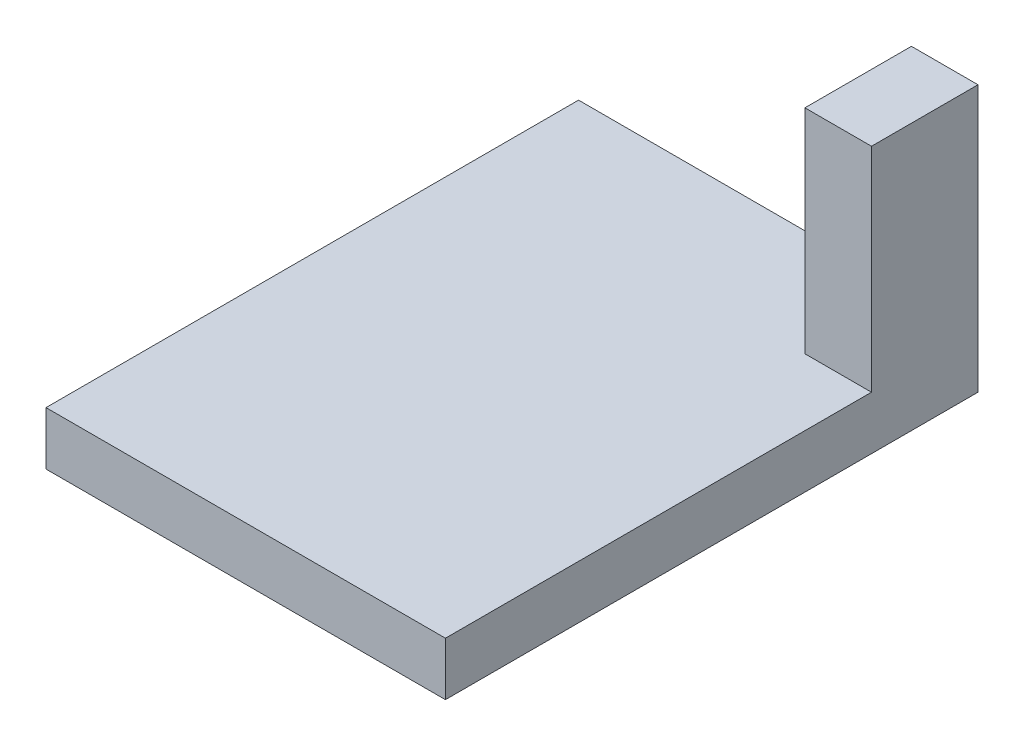
ISO-10303-21;
HEADER;
FILE_DESCRIPTION(('STEP AP214'),'2;1');
FILE_NAME('part.step','',(''),(''),'','','');
FILE_SCHEMA(('AUTOMOTIVE_DESIGN { 1 0 10303 214 1 1 1 1 }'));
ENDSEC;
DATA;
#1=APPLICATION_CONTEXT('core data for automotive mechanical design processes');
#2=APPLICATION_PROTOCOL_DEFINITION('international standard','automotive_design',2000,#1);
#3=PRODUCT_CONTEXT('',#1,'mechanical');
#4=PRODUCT('Part','Part','',(#3));
#5=PRODUCT_RELATED_PRODUCT_CATEGORY('part','',(#4));
#6=PRODUCT_DEFINITION_FORMATION('','',#4);
#7=PRODUCT_DEFINITION_CONTEXT('part definition',#1,'design');
#8=PRODUCT_DEFINITION('design','',#6,#7);
#9=PRODUCT_DEFINITION_SHAPE('','',#8);
#10=(LENGTH_UNIT() NAMED_UNIT(*) SI_UNIT(.MILLI.,.METRE.));
#11=(NAMED_UNIT(*) PLANE_ANGLE_UNIT() SI_UNIT($,.RADIAN.));
#12=(NAMED_UNIT(*) SI_UNIT($,.STERADIAN.) SOLID_ANGLE_UNIT());
#13=UNCERTAINTY_MEASURE_WITH_UNIT(LENGTH_MEASURE(1.E-05),#10,'distance_accuracy_value','');
#14=(GEOMETRIC_REPRESENTATION_CONTEXT(3) GLOBAL_UNCERTAINTY_ASSIGNED_CONTEXT((#13)) GLOBAL_UNIT_ASSIGNED_CONTEXT((#10,
#11,#12)) REPRESENTATION_CONTEXT('',''));
#15=CARTESIAN_POINT('',(0.,0.,0.));
#16=DIRECTION('',(0.,0.,1.));
#17=DIRECTION('',(1.,0.,0.));
#18=AXIS2_PLACEMENT_3D('',#15,#16,#17);
#19=CARTESIAN_POINT('',(0.,8.,0.));
#20=DIRECTION('',(1.,0.,0.));
#21=DIRECTION('',(0.,0.,-1.));
#22=AXIS2_PLACEMENT_3D('',#19,#20,#21);
#23=PLANE('',#22);
#24=DIRECTION('',(0.,0.,1.));
#25=VECTOR('',#24,1.);
#26=CARTESIAN_POINT('',(0.,0.,0.));
#27=LINE('',#26,#25);
#28=CARTESIAN_POINT('',(0.,0.,-4.));
#29=VERTEX_POINT('',#28);
#30=CARTESIAN_POINT('',(0.,0.,0.));
#31=VERTEX_POINT('',#30);
#32=EDGE_CURVE('E117',#29,#31,#27,.T.);
#33=ORIENTED_EDGE('',*,*,#32,.T.);
#34=DIRECTION('',(0.,-1.,0.));
#35=VECTOR('',#34,1.);
#36=CARTESIAN_POINT('',(0.,8.,0.));
#37=LINE('',#36,#35);
#38=CARTESIAN_POINT('',(0.,8.,0.));
#39=VERTEX_POINT('',#38);
#40=EDGE_CURVE('E11',#39,#31,#37,.T.);
#41=ORIENTED_EDGE('',*,*,#40,.F.);
#42=DIRECTION('',(0.,0.,1.));
#43=VECTOR('',#42,1.);
#44=CARTESIAN_POINT('',(0.,8.,0.));
#45=LINE('',#44,#43);
#46=CARTESIAN_POINT('',(0.,8.,-4.));
#47=VERTEX_POINT('',#46);
#48=EDGE_CURVE('E126',#47,#39,#45,.T.);
#49=ORIENTED_EDGE('',*,*,#48,.F.);
#50=DIRECTION('',(0.,-1.,0.));
#51=VECTOR('',#50,1.);
#52=CARTESIAN_POINT('',(0.,8.,-4.));
#53=LINE('',#52,#51);
#54=EDGE_CURVE('E132',#47,#29,#53,.T.);
#55=ORIENTED_EDGE('',*,*,#54,.T.);
#56=EDGE_LOOP('',(#33,#41,#49,#55));
#57=FACE_BOUND('',#56,.T.);
#58=ADVANCED_FACE('F37',(#57),#23,.F.);
#59=CARTESIAN_POINT('',(0.,8.,0.));
#60=DIRECTION('',(0.,0.,-1.));
#61=DIRECTION('',(-1.,0.,0.));
#62=AXIS2_PLACEMENT_3D('',#59,#60,#61);
#63=PLANE('',#62);
#64=DIRECTION('',(1.,0.,0.));
#65=VECTOR('',#64,1.);
#66=CARTESIAN_POINT('',(0.,0.,0.));
#67=LINE('',#66,#65);
#68=CARTESIAN_POINT('',(2.5,0.,0.));
#69=VERTEX_POINT('',#68);
#70=EDGE_CURVE('E120',#31,#69,#67,.T.);
#71=ORIENTED_EDGE('',*,*,#70,.T.);
#72=DIRECTION('',(0.,-1.,0.));
#73=VECTOR('',#72,1.);
#74=CARTESIAN_POINT('',(2.5,8.,0.));
#75=LINE('',#74,#73);
#76=CARTESIAN_POINT('',(2.5,8.,0.));
#77=VERTEX_POINT('',#76);
#78=EDGE_CURVE('E45',#77,#69,#75,.T.);
#79=ORIENTED_EDGE('',*,*,#78,.F.);
#80=DIRECTION('',(1.,0.,0.));
#81=VECTOR('',#80,1.);
#82=CARTESIAN_POINT('',(0.,8.,0.));
#83=LINE('',#82,#81);
#84=EDGE_CURVE('E128',#39,#77,#83,.T.);
#85=ORIENTED_EDGE('',*,*,#84,.F.);
#86=ORIENTED_EDGE('',*,*,#40,.T.);
#87=EDGE_LOOP('',(#71,#79,#85,#86));
#88=FACE_BOUND('',#87,.T.);
#89=ADVANCED_FACE('F142',(#88),#63,.F.);
#90=CARTESIAN_POINT('',(2.5,8.,0.));
#91=DIRECTION('',(-1.,0.,0.));
#92=DIRECTION('',(0.,0.,1.));
#93=AXIS2_PLACEMENT_3D('',#90,#91,#92);
#94=PLANE('',#93);
#95=ORIENTED_EDGE('',*,*,#78,.T.);
#96=DIRECTION('',(0.,0.,1.));
#97=VECTOR('',#96,1.);
#98=CARTESIAN_POINT('',(2.5,0.,-4.));
#99=LINE('',#98,#97);
#100=CARTESIAN_POINT('',(2.5,0.,16.));
#101=VERTEX_POINT('',#100);
#102=EDGE_CURVE('E115',#69,#101,#99,.T.);
#103=ORIENTED_EDGE('',*,*,#102,.T.);
#104=DIRECTION('',(0.,1.,0.));
#105=VECTOR('',#104,1.);
#106=CARTESIAN_POINT('',(2.5,-2.,16.));
#107=LINE('',#106,#105);
#108=CARTESIAN_POINT('',(2.5,-2.,16.));
#109=VERTEX_POINT('',#108);
#110=EDGE_CURVE('E95',#109,#101,#107,.T.);
#111=ORIENTED_EDGE('',*,*,#110,.F.);
#112=DIRECTION('',(0.,0.,1.));
#113=VECTOR('',#112,1.);
#114=CARTESIAN_POINT('',(2.5,-2.,-4.));
#115=LINE('',#114,#113);
#116=CARTESIAN_POINT('',(2.5,-2.,-4.));
#117=VERTEX_POINT('',#116);
#118=EDGE_CURVE('E101',#117,#109,#115,.T.);
#119=ORIENTED_EDGE('',*,*,#118,.F.);
#120=DIRECTION('',(0.,-1.,0.));
#121=VECTOR('',#120,1.);
#122=CARTESIAN_POINT('',(2.5,8.,-4.));
#123=LINE('',#122,#121);
#124=CARTESIAN_POINT('',(2.5,8.,-4.));
#125=VERTEX_POINT('',#124);
#126=EDGE_CURVE('E138',#125,#117,#123,.T.);
#127=ORIENTED_EDGE('',*,*,#126,.F.);
#128=DIRECTION('',(0.,0.,-1.));
#129=VECTOR('',#128,1.);
#130=CARTESIAN_POINT('',(2.5,8.,0.));
#131=LINE('',#130,#129);
#132=EDGE_CURVE('E130',#77,#125,#131,.T.);
#133=ORIENTED_EDGE('',*,*,#132,.F.);
#134=EDGE_LOOP('',(#95,#103,#111,#119,#127,#133));
#135=FACE_BOUND('',#134,.T.);
#136=ADVANCED_FACE('F113',(#135),#94,.F.);
#137=CARTESIAN_POINT('',(0.,8.,-4.));
#138=DIRECTION('',(0.,0.,1.));
#139=DIRECTION('',(1.,0.,0.));
#140=AXIS2_PLACEMENT_3D('',#137,#138,#139);
#141=PLANE('',#140);
#142=ORIENTED_EDGE('',*,*,#126,.T.);
#143=DIRECTION('',(1.,0.,0.));
#144=VECTOR('',#143,1.);
#145=CARTESIAN_POINT('',(2.5,-2.,-4.));
#146=LINE('',#145,#144);
#147=CARTESIAN_POINT('',(-12.5,-2.,-4.));
#148=VERTEX_POINT('',#147);
#149=EDGE_CURVE('E107',#148,#117,#146,.T.);
#150=ORIENTED_EDGE('',*,*,#149,.F.);
#151=DIRECTION('',(0.,1.,0.));
#152=VECTOR('',#151,1.);
#153=CARTESIAN_POINT('',(-12.5,-2.,-4.));
#154=LINE('',#153,#152);
#155=CARTESIAN_POINT('',(-12.5,0.,-4.));
#156=VERTEX_POINT('',#155);
#157=EDGE_CURVE('E122',#148,#156,#154,.T.);
#158=ORIENTED_EDGE('',*,*,#157,.T.);
#159=DIRECTION('',(1.,0.,0.));
#160=VECTOR('',#159,1.);
#161=CARTESIAN_POINT('',(2.5,0.,-4.));
#162=LINE('',#161,#160);
#163=EDGE_CURVE('E110',#156,#29,#162,.T.);
#164=ORIENTED_EDGE('',*,*,#163,.T.);
#165=ORIENTED_EDGE('',*,*,#54,.F.);
#166=DIRECTION('',(-1.,0.,0.));
#167=VECTOR('',#166,1.);
#168=CARTESIAN_POINT('',(0.,8.,-4.));
#169=LINE('',#168,#167);
#170=EDGE_CURVE('E52',#125,#47,#169,.T.);
#171=ORIENTED_EDGE('',*,*,#170,.F.);
#172=EDGE_LOOP('',(#142,#150,#158,#164,#165,#171));
#173=FACE_BOUND('',#172,.T.);
#174=ADVANCED_FACE('F162',(#173),#141,.F.);
#175=CARTESIAN_POINT('',(0.,8.,0.));
#176=DIRECTION('',(0.,-1.,0.));
#177=DIRECTION('',(0.,0.,-1.));
#178=AXIS2_PLACEMENT_3D('',#175,#176,#177);
#179=PLANE('',#178);
#180=ORIENTED_EDGE('',*,*,#48,.T.);
#181=ORIENTED_EDGE('',*,*,#84,.T.);
#182=ORIENTED_EDGE('',*,*,#132,.T.);
#183=ORIENTED_EDGE('',*,*,#170,.T.);
#184=EDGE_LOOP('',(#180,#181,#182,#183));
#185=FACE_BOUND('',#184,.T.);
#186=ADVANCED_FACE('F165',(#185),#179,.F.);
#187=CARTESIAN_POINT('',(2.5,-2.,16.));
#188=DIRECTION('',(0.,0.,-1.));
#189=DIRECTION('',(-1.,0.,0.));
#190=AXIS2_PLACEMENT_3D('',#187,#188,#189);
#191=PLANE('',#190);
#192=DIRECTION('',(-1.,0.,0.));
#193=VECTOR('',#192,1.);
#194=CARTESIAN_POINT('',(2.5,0.,16.));
#195=LINE('',#194,#193);
#196=CARTESIAN_POINT('',(-12.5,0.,16.));
#197=VERTEX_POINT('',#196);
#198=EDGE_CURVE('E149',#101,#197,#195,.T.);
#199=ORIENTED_EDGE('',*,*,#198,.T.);
#200=DIRECTION('',(0.,1.,0.));
#201=VECTOR('',#200,1.);
#202=CARTESIAN_POINT('',(-12.5,-2.,16.));
#203=LINE('',#202,#201);
#204=CARTESIAN_POINT('',(-12.5,-2.,16.));
#205=VERTEX_POINT('',#204);
#206=EDGE_CURVE('E97',#205,#197,#203,.T.);
#207=ORIENTED_EDGE('',*,*,#206,.F.);
#208=DIRECTION('',(-1.,0.,0.));
#209=VECTOR('',#208,1.);
#210=CARTESIAN_POINT('',(2.5,-2.,16.));
#211=LINE('',#210,#209);
#212=EDGE_CURVE('E91',#109,#205,#211,.T.);
#213=ORIENTED_EDGE('',*,*,#212,.F.);
#214=ORIENTED_EDGE('',*,*,#110,.T.);
#215=EDGE_LOOP('',(#199,#207,#213,#214));
#216=FACE_BOUND('',#215,.T.);
#217=ADVANCED_FACE('F93',(#216),#191,.F.);
#218=CARTESIAN_POINT('',(-12.5,-2.,-4.));
#219=DIRECTION('',(1.,0.,0.));
#220=DIRECTION('',(0.,0.,-1.));
#221=AXIS2_PLACEMENT_3D('',#218,#219,#220);
#222=PLANE('',#221);
#223=DIRECTION('',(0.,0.,-1.));
#224=VECTOR('',#223,1.);
#225=CARTESIAN_POINT('',(-12.5,0.,-4.));
#226=LINE('',#225,#224);
#227=EDGE_CURVE('E151',#197,#156,#226,.T.);
#228=ORIENTED_EDGE('',*,*,#227,.T.);
#229=ORIENTED_EDGE('',*,*,#157,.F.);
#230=DIRECTION('',(0.,0.,-1.));
#231=VECTOR('',#230,1.);
#232=CARTESIAN_POINT('',(-12.5,-2.,-4.));
#233=LINE('',#232,#231);
#234=EDGE_CURVE('E100',#205,#148,#233,.T.);
#235=ORIENTED_EDGE('',*,*,#234,.F.);
#236=ORIENTED_EDGE('',*,*,#206,.T.);
#237=EDGE_LOOP('',(#228,#229,#235,#236));
#238=FACE_BOUND('',#237,.T.);
#239=ADVANCED_FACE('F161',(#238),#222,.F.);
#240=CARTESIAN_POINT('',(0.,-2.,0.));
#241=DIRECTION('',(0.,-1.,0.));
#242=DIRECTION('',(0.,0.,-1.));
#243=AXIS2_PLACEMENT_3D('',#240,#241,#242);
#244=PLANE('',#243);
#245=ORIENTED_EDGE('',*,*,#118,.T.);
#246=ORIENTED_EDGE('',*,*,#212,.T.);
#247=ORIENTED_EDGE('',*,*,#234,.T.);
#248=ORIENTED_EDGE('',*,*,#149,.T.);
#249=EDGE_LOOP('',(#245,#246,#247,#248));
#250=FACE_BOUND('',#249,.T.);
#251=ADVANCED_FACE('F105',(#250),#244,.T.);
#252=CARTESIAN_POINT('',(0.,0.,0.));
#253=DIRECTION('',(0.,-1.,0.));
#254=DIRECTION('',(0.,0.,-1.));
#255=AXIS2_PLACEMENT_3D('',#252,#253,#254);
#256=PLANE('',#255);
#257=ORIENTED_EDGE('',*,*,#32,.F.);
#258=ORIENTED_EDGE('',*,*,#163,.F.);
#259=ORIENTED_EDGE('',*,*,#227,.F.);
#260=ORIENTED_EDGE('',*,*,#198,.F.);
#261=ORIENTED_EDGE('',*,*,#102,.F.);
#262=ORIENTED_EDGE('',*,*,#70,.F.);
#263=EDGE_LOOP('',(#257,#258,#259,#260,#261,#262));
#264=FACE_BOUND('',#263,.T.);
#265=ADVANCED_FACE('F145',(#264),#256,.F.);
#266=CLOSED_SHELL('',(#58,#89,#136,#174,#186,#217,#239,#251,#265));
#267=MANIFOLD_SOLID_BREP('B2',#266);
#268=ADVANCED_BREP_SHAPE_REPRESENTATION('',(#18,#267),#14);
#269=SHAPE_DEFINITION_REPRESENTATION(#9,#268);
ENDSEC;
END-ISO-10303-21;
